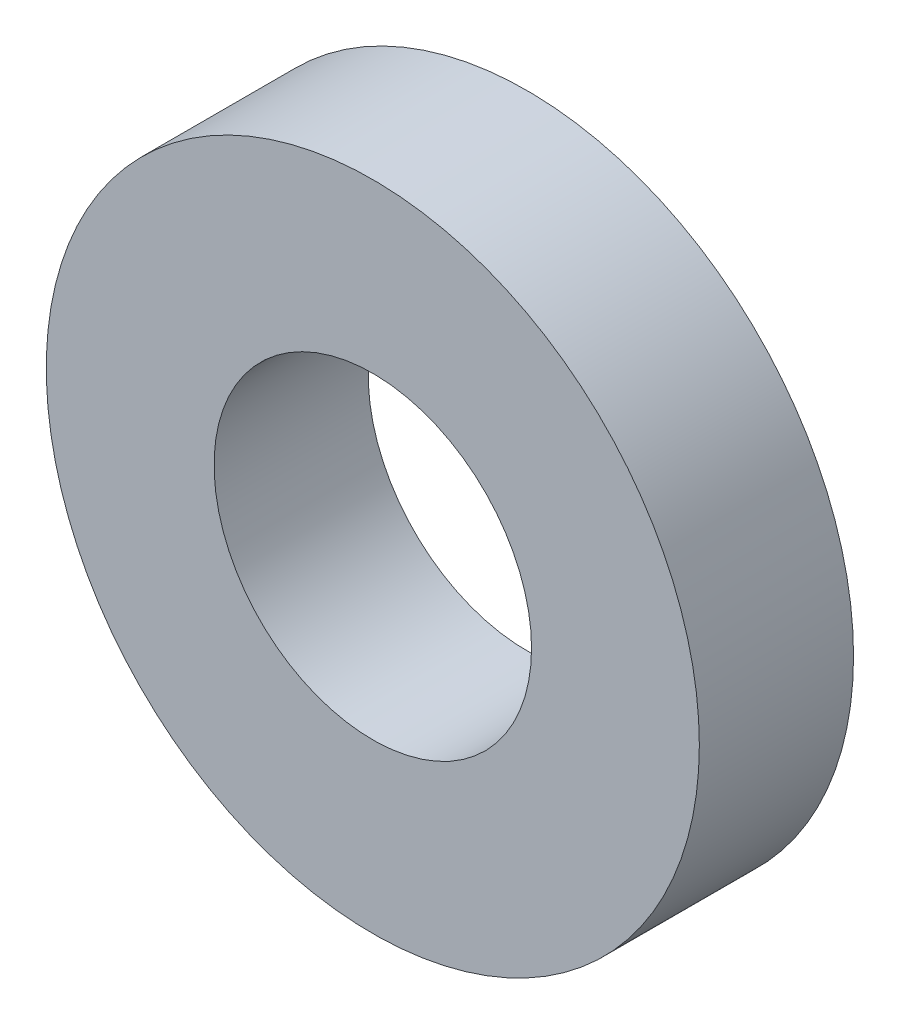
ISO-10303-21;
HEADER;
FILE_DESCRIPTION(('STEP AP214'),'2;1');
FILE_NAME('part.step','',(''),(''),'','','');
FILE_SCHEMA(('AUTOMOTIVE_DESIGN { 1 0 10303 214 1 1 1 1 }'));
ENDSEC;
DATA;
#1=APPLICATION_CONTEXT('core data for automotive mechanical design processes');
#2=APPLICATION_PROTOCOL_DEFINITION('international standard','automotive_design',2000,#1);
#3=PRODUCT_CONTEXT('',#1,'mechanical');
#4=PRODUCT('Part','Part','',(#3));
#5=PRODUCT_RELATED_PRODUCT_CATEGORY('part','',(#4));
#6=PRODUCT_DEFINITION_FORMATION('','',#4);
#7=PRODUCT_DEFINITION_CONTEXT('part definition',#1,'design');
#8=PRODUCT_DEFINITION('design','',#6,#7);
#9=PRODUCT_DEFINITION_SHAPE('','',#8);
#10=(LENGTH_UNIT() NAMED_UNIT(*) SI_UNIT(.MILLI.,.METRE.));
#11=(NAMED_UNIT(*) PLANE_ANGLE_UNIT() SI_UNIT($,.RADIAN.));
#12=(NAMED_UNIT(*) SI_UNIT($,.STERADIAN.) SOLID_ANGLE_UNIT());
#13=UNCERTAINTY_MEASURE_WITH_UNIT(LENGTH_MEASURE(1.E-05),#10,'distance_accuracy_value','');
#14=(GEOMETRIC_REPRESENTATION_CONTEXT(3) GLOBAL_UNCERTAINTY_ASSIGNED_CONTEXT((#13)) GLOBAL_UNIT_ASSIGNED_CONTEXT((#10,
#11,#12)) REPRESENTATION_CONTEXT('',''));
#15=CARTESIAN_POINT('',(0.,0.,0.));
#16=DIRECTION('',(0.,0.,1.));
#17=DIRECTION('',(1.,0.,0.));
#18=AXIS2_PLACEMENT_3D('',#15,#16,#17);
#19=CARTESIAN_POINT('',(0.,0.,8.5));
#20=DIRECTION('',(0.,0.,1.));
#21=DIRECTION('',(1.,0.,0.));
#22=AXIS2_PLACEMENT_3D('',#19,#20,#21);
#23=PLANE('',#22);
#24=CARTESIAN_POINT('',(0.,0.,8.5));
#25=DIRECTION('',(0.,0.,1.));
#26=DIRECTION('',(1.,0.,0.));
#27=AXIS2_PLACEMENT_3D('',#24,#25,#26);
#28=CIRCLE('',#27,36.);
#29=CARTESIAN_POINT('',(36.,0.,8.5));
#30=VERTEX_POINT('',#29);
#31=EDGE_CURVE('E10',#30,#30,#28,.T.);
#32=ORIENTED_EDGE('',*,*,#31,.T.);
#33=EDGE_LOOP('',(#32));
#34=FACE_BOUND('',#33,.T.);
#35=CARTESIAN_POINT('',(0.,0.,8.5));
#36=DIRECTION('',(0.,0.,1.));
#37=DIRECTION('',(1.,0.,0.));
#38=AXIS2_PLACEMENT_3D('',#35,#36,#37);
#39=CIRCLE('',#38,17.5);
#40=CARTESIAN_POINT('',(17.5,0.,8.5));
#41=VERTEX_POINT('',#40);
#42=EDGE_CURVE('E53',#41,#41,#39,.T.);
#43=ORIENTED_EDGE('',*,*,#42,.F.);
#44=EDGE_LOOP('',(#43));
#45=FACE_BOUND('',#44,.T.);
#46=ADVANCED_FACE('F40',(#34,#45),#23,.T.);
#47=CARTESIAN_POINT('',(0.,0.,-8.5));
#48=DIRECTION('',(0.,0.,1.));
#49=DIRECTION('',(1.,0.,0.));
#50=AXIS2_PLACEMENT_3D('',#47,#48,#49);
#51=PLANE('',#50);
#52=CARTESIAN_POINT('',(0.,0.,-8.5));
#53=DIRECTION('',(0.,0.,1.));
#54=DIRECTION('',(1.,0.,0.));
#55=AXIS2_PLACEMENT_3D('',#52,#53,#54);
#56=CIRCLE('',#55,36.);
#57=CARTESIAN_POINT('',(36.,0.,-8.5));
#58=VERTEX_POINT('',#57);
#59=EDGE_CURVE('E44',#58,#58,#56,.T.);
#60=ORIENTED_EDGE('',*,*,#59,.F.);
#61=EDGE_LOOP('',(#60));
#62=FACE_BOUND('',#61,.T.);
#63=CARTESIAN_POINT('',(0.,0.,-8.5));
#64=DIRECTION('',(0.,0.,1.));
#65=DIRECTION('',(1.,0.,0.));
#66=AXIS2_PLACEMENT_3D('',#63,#64,#65);
#67=CIRCLE('',#66,17.5);
#68=CARTESIAN_POINT('',(17.5,0.,-8.5));
#69=VERTEX_POINT('',#68);
#70=EDGE_CURVE('E55',#69,#69,#67,.T.);
#71=ORIENTED_EDGE('',*,*,#70,.T.);
#72=EDGE_LOOP('',(#71));
#73=FACE_BOUND('',#72,.T.);
#74=ADVANCED_FACE('F67',(#62,#73),#51,.F.);
#75=CARTESIAN_POINT('',(0.,0.,8.5));
#76=DIRECTION('',(0.,0.,-1.));
#77=DIRECTION('',(-1.,0.,0.));
#78=AXIS2_PLACEMENT_3D('',#75,#76,#77);
#79=CYLINDRICAL_SURFACE('',#78,36.);
#80=ORIENTED_EDGE('',*,*,#31,.F.);
#81=EDGE_LOOP('',(#80));
#82=FACE_BOUND('',#81,.T.);
#83=ORIENTED_EDGE('',*,*,#59,.T.);
#84=EDGE_LOOP('',(#83));
#85=FACE_BOUND('',#84,.T.);
#86=ADVANCED_FACE('F42',(#82,#85),#79,.T.);
#87=CARTESIAN_POINT('',(0.,0.,8.5));
#88=DIRECTION('',(0.,0.,-1.));
#89=DIRECTION('',(-1.,0.,0.));
#90=AXIS2_PLACEMENT_3D('',#87,#88,#89);
#91=CYLINDRICAL_SURFACE('',#90,17.5);
#92=ORIENTED_EDGE('',*,*,#42,.T.);
#93=EDGE_LOOP('',(#92));
#94=FACE_BOUND('',#93,.T.);
#95=ORIENTED_EDGE('',*,*,#70,.F.);
#96=EDGE_LOOP('',(#95));
#97=FACE_BOUND('',#96,.T.);
#98=ADVANCED_FACE('F63',(#94,#97),#91,.F.);
#99=CLOSED_SHELL('',(#46,#74,#86,#98));
#100=MANIFOLD_SOLID_BREP('B2',#99);
#101=ADVANCED_BREP_SHAPE_REPRESENTATION('',(#18,#100),#14);
#102=SHAPE_DEFINITION_REPRESENTATION(#9,#101);
ENDSEC;
END-ISO-10303-21;
